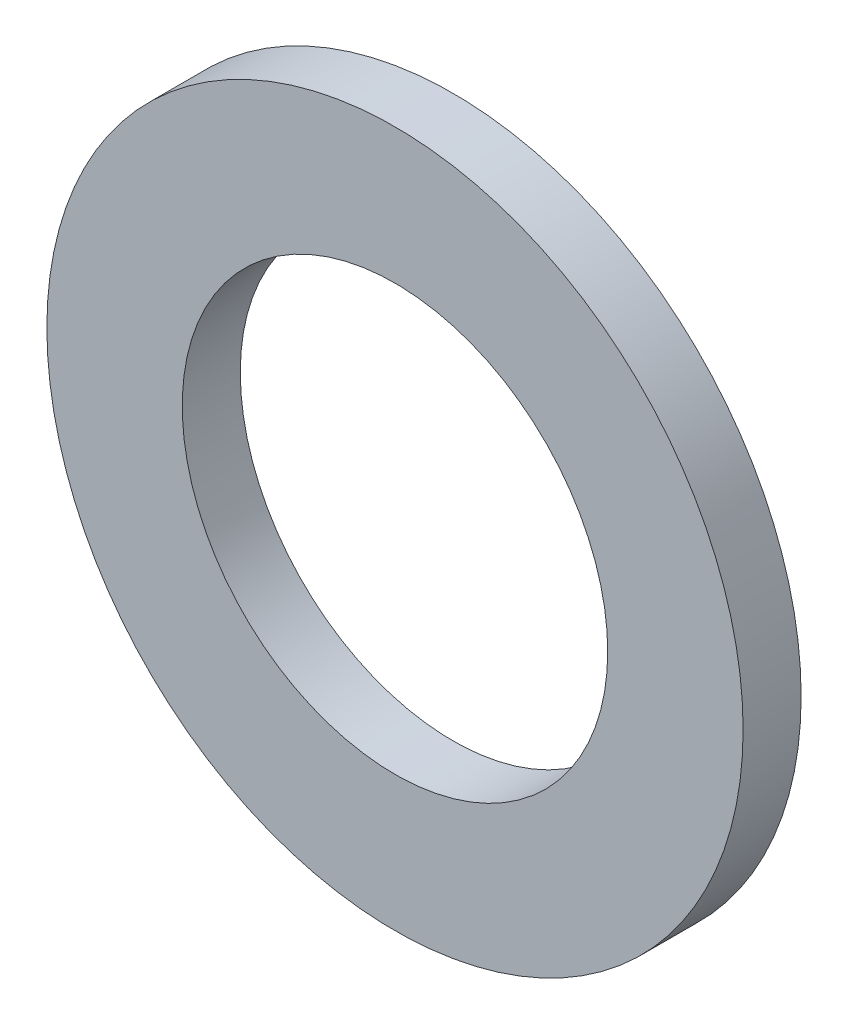
ISO-10303-21;
HEADER;
FILE_DESCRIPTION(('STEP AP214'),'2;1');
FILE_NAME('part.step','',(''),(''),'','','');
FILE_SCHEMA(('AUTOMOTIVE_DESIGN { 1 0 10303 214 1 1 1 1 }'));
ENDSEC;
DATA;
#1=APPLICATION_CONTEXT('core data for automotive mechanical design processes');
#2=APPLICATION_PROTOCOL_DEFINITION('international standard','automotive_design',2000,#1);
#3=PRODUCT_CONTEXT('',#1,'mechanical');
#4=PRODUCT('Part','Part','',(#3));
#5=PRODUCT_RELATED_PRODUCT_CATEGORY('part','',(#4));
#6=PRODUCT_DEFINITION_FORMATION('','',#4);
#7=PRODUCT_DEFINITION_CONTEXT('part definition',#1,'design');
#8=PRODUCT_DEFINITION('design','',#6,#7);
#9=PRODUCT_DEFINITION_SHAPE('','',#8);
#10=(LENGTH_UNIT() NAMED_UNIT(*) SI_UNIT(.MILLI.,.METRE.));
#11=(NAMED_UNIT(*) PLANE_ANGLE_UNIT() SI_UNIT($,.RADIAN.));
#12=(NAMED_UNIT(*) SI_UNIT($,.STERADIAN.) SOLID_ANGLE_UNIT());
#13=UNCERTAINTY_MEASURE_WITH_UNIT(LENGTH_MEASURE(1.E-05),#10,'distance_accuracy_value','');
#14=(GEOMETRIC_REPRESENTATION_CONTEXT(3) GLOBAL_UNCERTAINTY_ASSIGNED_CONTEXT((#13)) GLOBAL_UNIT_ASSIGNED_CONTEXT((#10,
#11,#12)) REPRESENTATION_CONTEXT('',''));
#15=CARTESIAN_POINT('',(0.,0.,0.));
#16=DIRECTION('',(0.,0.,1.));
#17=DIRECTION('',(1.,0.,0.));
#18=AXIS2_PLACEMENT_3D('',#15,#16,#17);
#19=CARTESIAN_POINT('',(0.,0.,0.300000000000009));
#20=DIRECTION('',(0.,0.,1.));
#21=DIRECTION('',(1.00000000000004,0.,0.));
#22=AXIS2_PLACEMENT_3D('',#19,#20,#21);
#23=PLANE('',#22);
#24=CARTESIAN_POINT('',(0.,0.,0.300000000000009));
#25=DIRECTION('',(0.,0.,1.));
#26=DIRECTION('',(1.00000000000004,0.,0.));
#27=AXIS2_PLACEMENT_3D('',#24,#25,#26);
#28=CIRCLE('',#27,1.1);
#29=CARTESIAN_POINT('',(1.10000000000004,0.,0.300000000000009));
#30=VERTEX_POINT('',#29);
#31=EDGE_CURVE('E29',#30,#30,#28,.T.);
#32=ORIENTED_EDGE('',*,*,#31,.F.);
#33=EDGE_LOOP('',(#32));
#34=FACE_BOUND('',#33,.T.);
#35=CARTESIAN_POINT('',(0.,0.,0.300000000000009));
#36=DIRECTION('',(0.,0.,-1.));
#37=DIRECTION('',(-1.00000000000004,0.,0.));
#38=AXIS2_PLACEMENT_3D('',#35,#36,#37);
#39=CIRCLE('',#38,1.8);
#40=CARTESIAN_POINT('',(-1.80000000000007,0.,0.300000000000009));
#41=VERTEX_POINT('',#40);
#42=EDGE_CURVE('E10',#41,#41,#39,.T.);
#43=ORIENTED_EDGE('',*,*,#42,.F.);
#44=EDGE_LOOP('',(#43));
#45=FACE_BOUND('',#44,.T.);
#46=ADVANCED_FACE('F14',(#34,#45),#23,.T.);
#47=CARTESIAN_POINT('',(0.,0.,0.));
#48=DIRECTION('',(0.,0.,-1.));
#49=DIRECTION('',(-1.00000000000004,0.,0.));
#50=AXIS2_PLACEMENT_3D('',#47,#48,#49);
#51=PLANE('',#50);
#52=CARTESIAN_POINT('',(0.,0.,0.));
#53=DIRECTION('',(0.,0.,-1.));
#54=DIRECTION('',(-1.00000000000004,0.,0.));
#55=AXIS2_PLACEMENT_3D('',#52,#53,#54);
#56=CIRCLE('',#55,1.1);
#57=CARTESIAN_POINT('',(-1.10000000000004,0.,0.));
#58=VERTEX_POINT('',#57);
#59=EDGE_CURVE('E18',#58,#58,#56,.T.);
#60=ORIENTED_EDGE('',*,*,#59,.F.);
#61=EDGE_LOOP('',(#60));
#62=FACE_BOUND('',#61,.T.);
#63=CARTESIAN_POINT('',(0.,0.,0.));
#64=DIRECTION('',(0.,0.,1.));
#65=DIRECTION('',(1.00000000000004,0.,0.));
#66=AXIS2_PLACEMENT_3D('',#63,#64,#65);
#67=CIRCLE('',#66,1.8);
#68=CARTESIAN_POINT('',(1.80000000000007,0.,0.));
#69=VERTEX_POINT('',#68);
#70=EDGE_CURVE('E23',#69,#69,#67,.T.);
#71=ORIENTED_EDGE('',*,*,#70,.F.);
#72=EDGE_LOOP('',(#71));
#73=FACE_BOUND('',#72,.T.);
#74=ADVANCED_FACE('F42',(#62,#73),#51,.T.);
#75=CARTESIAN_POINT('',(0.,0.,0.));
#76=DIRECTION('',(0.,0.,1.));
#77=DIRECTION('',(1.00000000000004,0.,0.));
#78=AXIS2_PLACEMENT_3D('',#75,#76,#77);
#79=CYLINDRICAL_SURFACE('',#78,1.8);
#80=ORIENTED_EDGE('',*,*,#42,.T.);
#81=EDGE_LOOP('',(#80));
#82=FACE_BOUND('',#81,.T.);
#83=ORIENTED_EDGE('',*,*,#70,.T.);
#84=EDGE_LOOP('',(#83));
#85=FACE_BOUND('',#84,.T.);
#86=ADVANCED_FACE('F16',(#82,#85),#79,.T.);
#87=CARTESIAN_POINT('',(0.,0.,-1.));
#88=DIRECTION('',(0.,0.,1.));
#89=DIRECTION('',(1.00000000000004,0.,0.));
#90=AXIS2_PLACEMENT_3D('',#87,#88,#89);
#91=CYLINDRICAL_SURFACE('',#90,1.1);
#92=ORIENTED_EDGE('',*,*,#31,.T.);
#93=EDGE_LOOP('',(#92));
#94=FACE_BOUND('',#93,.T.);
#95=ORIENTED_EDGE('',*,*,#59,.T.);
#96=EDGE_LOOP('',(#95));
#97=FACE_BOUND('',#96,.T.);
#98=ADVANCED_FACE('F40',(#94,#97),#91,.F.);
#99=CLOSED_SHELL('',(#46,#74,#86,#98));
#100=MANIFOLD_SOLID_BREP('B1',#99);
#101=ADVANCED_BREP_SHAPE_REPRESENTATION('',(#18,#100),#14);
#102=SHAPE_DEFINITION_REPRESENTATION(#9,#101);
ENDSEC;
END-ISO-10303-21;
